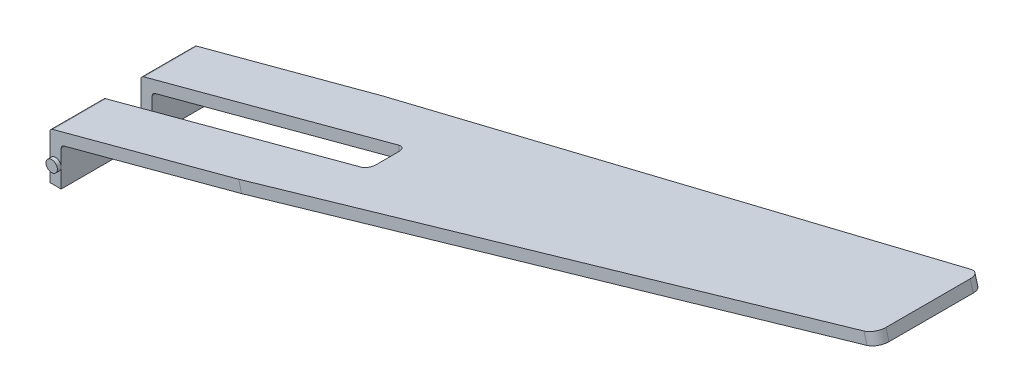
ISO-10303-21;
HEADER;
FILE_DESCRIPTION(('STEP AP214'),'2;1');
FILE_NAME('part.step','',(''),(''),'','','');
FILE_SCHEMA(('AUTOMOTIVE_DESIGN { 1 0 10303 214 1 1 1 1 }'));
ENDSEC;
DATA;
#1=APPLICATION_CONTEXT('core data for automotive mechanical design processes');
#2=APPLICATION_PROTOCOL_DEFINITION('international standard','automotive_design',2000,#1);
#3=PRODUCT_CONTEXT('',#1,'mechanical');
#4=PRODUCT('Part','Part','',(#3));
#5=PRODUCT_RELATED_PRODUCT_CATEGORY('part','',(#4));
#6=PRODUCT_DEFINITION_FORMATION('','',#4);
#7=PRODUCT_DEFINITION_CONTEXT('part definition',#1,'design');
#8=PRODUCT_DEFINITION('design','',#6,#7);
#9=PRODUCT_DEFINITION_SHAPE('','',#8);
#10=(LENGTH_UNIT() NAMED_UNIT(*) SI_UNIT(.MILLI.,.METRE.));
#11=(NAMED_UNIT(*) PLANE_ANGLE_UNIT() SI_UNIT($,.RADIAN.));
#12=(NAMED_UNIT(*) SI_UNIT($,.STERADIAN.) SOLID_ANGLE_UNIT());
#13=UNCERTAINTY_MEASURE_WITH_UNIT(LENGTH_MEASURE(1.E-05),#10,'distance_accuracy_value','');
#14=(GEOMETRIC_REPRESENTATION_CONTEXT(3) GLOBAL_UNCERTAINTY_ASSIGNED_CONTEXT((#13)) GLOBAL_UNIT_ASSIGNED_CONTEXT((#10,
#11,#12)) REPRESENTATION_CONTEXT('',''));
#15=CARTESIAN_POINT('',(0.,0.,0.));
#16=DIRECTION('',(0.,0.,1.));
#17=DIRECTION('',(1.,0.,0.));
#18=AXIS2_PLACEMENT_3D('',#15,#16,#17);
#19=CARTESIAN_POINT('',(0.3,0.,3.8));
#20=DIRECTION('',(0.,1.,0.));
#21=DIRECTION('',(0.,0.,1.));
#22=AXIS2_PLACEMENT_3D('',#19,#20,#21);
#23=PLANE('',#22);
#24=DIRECTION('',(0.,0.,-1.));
#25=VECTOR('',#24,1.);
#26=CARTESIAN_POINT('',(0.,0.,3.8));
#27=LINE('',#26,#25);
#28=CARTESIAN_POINT('',(0.,0.,3.8));
#29=VERTEX_POINT('',#28);
#30=CARTESIAN_POINT('',(0.,0.,2.40000000000001));
#31=VERTEX_POINT('',#30);
#32=EDGE_CURVE('E220',#29,#31,#27,.T.);
#33=ORIENTED_EDGE('',*,*,#32,.T.);
#34=DIRECTION('',(-1.,0.,0.));
#35=VECTOR('',#34,1.);
#36=CARTESIAN_POINT('',(0.,0.,2.40000000000001));
#37=LINE('',#36,#35);
#38=CARTESIAN_POINT('',(0.3,0.,2.40000000000001));
#39=VERTEX_POINT('',#38);
#40=EDGE_CURVE('E214',#39,#31,#37,.T.);
#41=ORIENTED_EDGE('',*,*,#40,.F.);
#42=DIRECTION('',(0.,0.,-1.));
#43=VECTOR('',#42,1.);
#44=CARTESIAN_POINT('',(0.3,0.,3.8));
#45=LINE('',#44,#43);
#46=CARTESIAN_POINT('',(0.3,0.,3.8));
#47=VERTEX_POINT('',#46);
#48=EDGE_CURVE('E236',#47,#39,#45,.T.);
#49=ORIENTED_EDGE('',*,*,#48,.F.);
#50=DIRECTION('',(1.,0.,0.));
#51=VECTOR('',#50,1.);
#52=CARTESIAN_POINT('',(0.3,0.,3.8));
#53=LINE('',#52,#51);
#54=EDGE_CURVE('E369',#29,#47,#53,.T.);
#55=ORIENTED_EDGE('',*,*,#54,.F.);
#56=EDGE_LOOP('',(#33,#41,#49,#55));
#57=FACE_BOUND('',#56,.T.);
#58=ADVANCED_FACE('F34',(#57),#23,.F.);
#59=CARTESIAN_POINT('',(0.3,1.,3.8));
#60=DIRECTION('',(-1.,0.,0.));
#61=DIRECTION('',(0.,-1.,0.));
#62=AXIS2_PLACEMENT_3D('',#59,#60,#61);
#63=PLANE('',#62);
#64=DIRECTION('',(0.,1.,0.));
#65=VECTOR('',#64,1.);
#66=CARTESIAN_POINT('',(0.3,1.,2.40000000000001));
#67=LINE('',#66,#65);
#68=CARTESIAN_POINT('',(0.3,0.923267301202103,2.40000000000001));
#69=VERTEX_POINT('',#68);
#70=EDGE_CURVE('E354',#39,#69,#67,.T.);
#71=ORIENTED_EDGE('',*,*,#70,.T.);
#72=DIRECTION('',(0.,0.,-1.));
#73=VECTOR('',#72,1.);
#74=CARTESIAN_POINT('',(0.3,0.923267301202103,3.8));
#75=LINE('',#74,#73);
#76=CARTESIAN_POINT('',(0.3,0.923267301202103,3.8));
#77=VERTEX_POINT('',#76);
#78=EDGE_CURVE('E287',#69,#77,#75,.F.);
#79=ORIENTED_EDGE('',*,*,#78,.T.);
#80=DIRECTION('',(0.,1.,0.));
#81=VECTOR('',#80,1.);
#82=CARTESIAN_POINT('',(0.3,1.,3.8));
#83=LINE('',#82,#81);
#84=CARTESIAN_POINT('',(0.3,0.5,3.8));
#85=VERTEX_POINT('',#84);
#86=EDGE_CURVE('E372',#85,#77,#83,.T.);
#87=ORIENTED_EDGE('',*,*,#86,.F.);
#88=EDGE_CURVE('E373',#47,#85,#83,.T.);
#89=ORIENTED_EDGE('',*,*,#88,.F.);
#90=ORIENTED_EDGE('',*,*,#48,.T.);
#91=EDGE_LOOP('',(#71,#79,#87,#89,#90));
#92=FACE_BOUND('',#91,.T.);
#93=ADVANCED_FACE('F423',(#92),#63,.F.);
#94=CARTESIAN_POINT('',(0.,0.,3.8));
#95=DIRECTION('',(1.,0.,0.));
#96=DIRECTION('',(0.,0.,-1.));
#97=AXIS2_PLACEMENT_3D('',#94,#95,#96);
#98=PLANE('',#97);
#99=DIRECTION('',(0.,-1.,0.));
#100=VECTOR('',#99,1.);
#101=CARTESIAN_POINT('',(0.,0.,3.8));
#102=LINE('',#101,#100);
#103=CARTESIAN_POINT('',(0.,1.15346539759579,3.8));
#104=VERTEX_POINT('',#103);
#105=CARTESIAN_POINT('',(0.,0.5,3.8));
#106=VERTEX_POINT('',#105);
#107=EDGE_CURVE('E221',#104,#106,#102,.T.);
#108=ORIENTED_EDGE('',*,*,#107,.F.);
#109=DIRECTION('',(0.,0.,-1.));
#110=VECTOR('',#109,1.);
#111=CARTESIAN_POINT('',(0.,1.15346539759579,3.8));
#112=LINE('',#111,#110);
#113=CARTESIAN_POINT('',(0.,1.15346539759579,2.40000000000001));
#114=VERTEX_POINT('',#113);
#115=EDGE_CURVE('E271',#104,#114,#112,.T.);
#116=ORIENTED_EDGE('',*,*,#115,.T.);
#117=DIRECTION('',(0.,-1.,0.));
#118=VECTOR('',#117,1.);
#119=CARTESIAN_POINT('',(0.,0.,2.40000000000001));
#120=LINE('',#119,#118);
#121=EDGE_CURVE('E205',#114,#31,#120,.T.);
#122=ORIENTED_EDGE('',*,*,#121,.T.);
#123=ORIENTED_EDGE('',*,*,#32,.F.);
#124=EDGE_CURVE('E225',#106,#29,#102,.T.);
#125=ORIENTED_EDGE('',*,*,#124,.F.);
#126=EDGE_LOOP('',(#108,#116,#122,#123,#125));
#127=FACE_BOUND('',#126,.T.);
#128=ADVANCED_FACE('F429',(#127),#98,.F.);
#129=CARTESIAN_POINT('',(0.,0.,3.8));
#130=DIRECTION('',(0.,0.,-1.));
#131=DIRECTION('',(-1.,0.,0.));
#132=AXIS2_PLACEMENT_3D('',#129,#130,#131);
#133=PLANE('',#132);
#134=DIRECTION('',(-0.965925826289069,-0.258819045102519,0.));
#135=VECTOR('',#134,1.);
#136=CARTESIAN_POINT('',(0.,1.23019809639369,3.8));
#137=LINE('',#136,#135);
#138=CARTESIAN_POINT('',(4.97765294954037,2.56395618442542,3.8));
#139=VERTEX_POINT('',#138);
#140=CARTESIAN_POINT('',(0.0741180954897481,1.2500579802247,3.8));
#141=VERTEX_POINT('',#140);
#142=EDGE_CURVE('E379',#139,#141,#137,.T.);
#143=ORIENTED_EDGE('',*,*,#142,.T.);
#144=CARTESIAN_POINT('',(0.1,1.15346539759579,3.8));
#145=DIRECTION('',(0.,0.,-1.));
#146=DIRECTION('',(-1.,0.,0.));
#147=AXIS2_PLACEMENT_3D('',#144,#145,#146);
#148=CIRCLE('',#147,0.1);
#149=EDGE_CURVE('E277',#141,#104,#148,.F.);
#150=ORIENTED_EDGE('',*,*,#149,.T.);
#151=ORIENTED_EDGE('',*,*,#107,.T.);
#152=CARTESIAN_POINT('',(0.15,0.5,3.8));
#153=DIRECTION('',(0.,0.,-1.));
#154=DIRECTION('',(-1.,0.,0.));
#155=AXIS2_PLACEMENT_3D('',#152,#153,#154);
#156=CIRCLE('',#155,0.15);
#157=EDGE_CURVE('E368',#106,#85,#156,.T.);
#158=ORIENTED_EDGE('',*,*,#157,.T.);
#159=ORIENTED_EDGE('',*,*,#86,.T.);
#160=CARTESIAN_POINT('',(0.400000000000001,0.923267301202103,3.8));
#161=DIRECTION('',(0.,0.,-1.));
#162=DIRECTION('',(-1.,0.,0.));
#163=AXIS2_PLACEMENT_3D('',#160,#161,#162);
#164=CIRCLE('',#163,0.1);
#165=CARTESIAN_POINT('',(0.374118095489748,1.01985988383101,3.8));
#166=VERTEX_POINT('',#165);
#167=EDGE_CURVE('E296',#77,#166,#164,.T.);
#168=ORIENTED_EDGE('',*,*,#167,.T.);
#169=DIRECTION('',(0.965925826289069,0.258819045102518,0.));
#170=VECTOR('',#169,1.);
#171=CARTESIAN_POINT('',(21.3280138918903,6.63443934076237,3.8));
#172=LINE('',#171,#170);
#173=CARTESIAN_POINT('',(5.05529866307113,2.27417843653869,3.8));
#174=VERTEX_POINT('',#173);
#175=EDGE_CURVE('E376',#166,#174,#172,.T.);
#176=ORIENTED_EDGE('',*,*,#175,.T.);
#177=DIRECTION('',(-0.258819045102525,0.965925826289067,0.));
#178=VECTOR('',#177,1.);
#179=CARTESIAN_POINT('',(5.28520247363879,1.41616573464651,3.8));
#180=LINE('',#179,#178);
#181=EDGE_CURVE('E239',#174,#139,#180,.T.);
#182=ORIENTED_EDGE('',*,*,#181,.T.);
#183=EDGE_LOOP('',(#143,#150,#151,#158,#159,#168,#176,#182));
#184=FACE_BOUND('',#183,.T.);
#185=ADVANCED_FACE('F440',(#184),#133,.F.);
#186=CARTESIAN_POINT('',(0.,0.,0.));
#187=DIRECTION('',(0.,0.,-1.));
#188=DIRECTION('',(-1.,0.,0.));
#189=AXIS2_PLACEMENT_3D('',#186,#187,#188);
#190=PLANE('',#189);
#191=DIRECTION('',(0.,-1.,0.));
#192=VECTOR('',#191,1.);
#193=CARTESIAN_POINT('',(0.,0.,0.));
#194=LINE('',#193,#192);
#195=CARTESIAN_POINT('',(0.,1.15346539759579,0.));
#196=VERTEX_POINT('',#195);
#197=CARTESIAN_POINT('',(0.,0.5,0.));
#198=VERTEX_POINT('',#197);
#199=EDGE_CURVE('E229',#196,#198,#194,.T.);
#200=ORIENTED_EDGE('',*,*,#199,.F.);
#201=CARTESIAN_POINT('',(0.1,1.15346539759579,0.));
#202=DIRECTION('',(0.,0.,-1.));
#203=DIRECTION('',(-1.,0.,0.));
#204=AXIS2_PLACEMENT_3D('',#201,#202,#203);
#205=CIRCLE('',#204,0.1);
#206=CARTESIAN_POINT('',(0.0741180954897481,1.2500579802247,0.));
#207=VERTEX_POINT('',#206);
#208=EDGE_CURVE('E264',#196,#207,#205,.T.);
#209=ORIENTED_EDGE('',*,*,#208,.T.);
#210=DIRECTION('',(-0.965925826289069,-0.258819045102519,0.));
#211=VECTOR('',#210,1.);
#212=CARTESIAN_POINT('',(0.,1.23019809639369,0.));
#213=LINE('',#212,#211);
#214=CARTESIAN_POINT('',(4.97765294954035,2.56395618442541,0.));
#215=VERTEX_POINT('',#214);
#216=EDGE_CURVE('E389',#215,#207,#213,.T.);
#217=ORIENTED_EDGE('',*,*,#216,.F.);
#218=DIRECTION('',(0.258819045102525,-0.965925826289067,0.));
#219=VECTOR('',#218,1.);
#220=CARTESIAN_POINT('',(5.05529866307114,2.27417843653857,0.));
#221=LINE('',#220,#219);
#222=CARTESIAN_POINT('',(5.05529866307111,2.27417843653869,0.));
#223=VERTEX_POINT('',#222);
#224=EDGE_CURVE('E252',#215,#223,#221,.T.);
#225=ORIENTED_EDGE('',*,*,#224,.T.);
#226=DIRECTION('',(0.965925826289069,0.258819045102518,0.));
#227=VECTOR('',#226,1.);
#228=CARTESIAN_POINT('',(21.3280138918903,6.63443934076237,0.));
#229=LINE('',#228,#227);
#230=CARTESIAN_POINT('',(0.374118095489748,1.01985988383101,0.));
#231=VERTEX_POINT('',#230);
#232=EDGE_CURVE('E388',#231,#223,#229,.T.);
#233=ORIENTED_EDGE('',*,*,#232,.F.);
#234=CARTESIAN_POINT('',(0.400000000000001,0.923267301202103,0.));
#235=DIRECTION('',(0.,0.,-1.));
#236=DIRECTION('',(-1.,0.,0.));
#237=AXIS2_PLACEMENT_3D('',#234,#235,#236);
#238=CIRCLE('',#237,0.1);
#239=CARTESIAN_POINT('',(0.3,0.923267301202103,0.));
#240=VERTEX_POINT('',#239);
#241=EDGE_CURVE('E289',#231,#240,#238,.F.);
#242=ORIENTED_EDGE('',*,*,#241,.T.);
#243=DIRECTION('',(0.,1.,0.));
#244=VECTOR('',#243,1.);
#245=CARTESIAN_POINT('',(0.3,1.,0.));
#246=LINE('',#245,#244);
#247=CARTESIAN_POINT('',(0.3,0.5,0.));
#248=VERTEX_POINT('',#247);
#249=EDGE_CURVE('E384',#248,#240,#246,.T.);
#250=ORIENTED_EDGE('',*,*,#249,.F.);
#251=CARTESIAN_POINT('',(0.15,0.5,0.));
#252=DIRECTION('',(0.,0.,-1.));
#253=DIRECTION('',(-1.,0.,0.));
#254=AXIS2_PLACEMENT_3D('',#251,#252,#253);
#255=CIRCLE('',#254,0.15);
#256=EDGE_CURVE('E206',#198,#248,#255,.T.);
#257=ORIENTED_EDGE('',*,*,#256,.F.);
#258=EDGE_LOOP('',(#200,#209,#217,#225,#233,#242,#250,#257));
#259=FACE_BOUND('',#258,.T.);
#260=ADVANCED_FACE('F401',(#259),#190,.T.);
#261=CARTESIAN_POINT('',(0.3,0.,1.4));
#262=VERTEX_POINT('',#261);
#263=CARTESIAN_POINT('',(0.3,0.,0.));
#264=VERTEX_POINT('',#263);
#265=EDGE_CURVE('E213',#262,#264,#45,.T.);
#266=ORIENTED_EDGE('',*,*,#265,.F.);
#267=DIRECTION('',(1.,0.,0.));
#268=VECTOR('',#267,1.);
#269=CARTESIAN_POINT('',(0.,0.,1.4));
#270=LINE('',#269,#268);
#271=CARTESIAN_POINT('',(0.,0.,1.4));
#272=VERTEX_POINT('',#271);
#273=EDGE_CURVE('E197',#272,#262,#270,.T.);
#274=ORIENTED_EDGE('',*,*,#273,.F.);
#275=CARTESIAN_POINT('',(0.,0.,0.));
#276=VERTEX_POINT('',#275);
#277=EDGE_CURVE('E211',#272,#276,#27,.T.);
#278=ORIENTED_EDGE('',*,*,#277,.T.);
#279=DIRECTION('',(1.,0.,0.));
#280=VECTOR('',#279,1.);
#281=CARTESIAN_POINT('',(0.3,0.,0.));
#282=LINE('',#281,#280);
#283=EDGE_CURVE('E382',#276,#264,#282,.T.);
#284=ORIENTED_EDGE('',*,*,#283,.T.);
#285=EDGE_LOOP('',(#266,#274,#278,#284));
#286=FACE_BOUND('',#285,.T.);
#287=ADVANCED_FACE('F209',(#286),#23,.F.);
#288=ORIENTED_EDGE('',*,*,#249,.T.);
#289=DIRECTION('',(0.,0.,-1.));
#290=VECTOR('',#289,1.);
#291=CARTESIAN_POINT('',(0.3,0.923267301202103,1.4));
#292=LINE('',#291,#290);
#293=CARTESIAN_POINT('',(0.3,0.923267301202103,1.4));
#294=VERTEX_POINT('',#293);
#295=EDGE_CURVE('E285',#240,#294,#292,.F.);
#296=ORIENTED_EDGE('',*,*,#295,.T.);
#297=DIRECTION('',(0.,-1.,0.));
#298=VECTOR('',#297,1.);
#299=CARTESIAN_POINT('',(0.3,1.,1.4));
#300=LINE('',#299,#298);
#301=EDGE_CURVE('E344',#294,#262,#300,.T.);
#302=ORIENTED_EDGE('',*,*,#301,.T.);
#303=ORIENTED_EDGE('',*,*,#265,.T.);
#304=EDGE_CURVE('E385',#264,#248,#246,.T.);
#305=ORIENTED_EDGE('',*,*,#304,.T.);
#306=EDGE_LOOP('',(#288,#296,#302,#303,#305));
#307=FACE_BOUND('',#306,.T.);
#308=ADVANCED_FACE('F432',(#307),#63,.F.);
#309=CARTESIAN_POINT('',(21.3280138918903,6.63443934076237,3.8));
#310=DIRECTION('',(-0.258819045102518,0.965925826289069,0.));
#311=DIRECTION('',(-0.965925826289069,-0.258819045102518,0.));
#312=AXIS2_PLACEMENT_3D('',#309,#310,#311);
#313=PLANE('',#312);
#314=DIRECTION('',(0.965500683811202,0.258705128518906,0.0296662440851079));
#315=VECTOR('',#314,1.);
#316=CARTESIAN_POINT('',(21.3280138918903,6.63443934076237,0.5));
#317=LINE('',#316,#315);
#318=CARTESIAN_POINT('',(21.0468327614028,6.55909708392138,0.491360349931353));
#319=VERTEX_POINT('',#318);
#320=EDGE_CURVE('E247',#223,#319,#317,.T.);
#321=ORIENTED_EDGE('',*,*,#320,.T.);
#322=CARTESIAN_POINT('',(21.0382361440036,6.55679362723161,0.791228307967169));
#323=DIRECTION('',(-0.258819045102518,0.965925826289069,0.));
#324=DIRECTION('',(-0.965925826289069,-0.258819045102518,0.));
#325=AXIS2_PLACEMENT_3D('',#322,#323,#324);
#326=CIRCLE('',#325,0.3);
#327=CARTESIAN_POINT('',(21.3280138918903,6.63443934076237,0.79122830796717));
#328=VERTEX_POINT('',#327);
#329=EDGE_CURVE('E312',#319,#328,#326,.F.);
#330=ORIENTED_EDGE('',*,*,#329,.T.);
#331=DIRECTION('',(0.,0.,-1.));
#332=VECTOR('',#331,1.);
#333=CARTESIAN_POINT('',(21.3280138918903,6.63443934076237,3.8));
#334=LINE('',#333,#332);
#335=CARTESIAN_POINT('',(21.3280138918903,6.63443934076237,3.00877169203283));
#336=VERTEX_POINT('',#335);
#337=EDGE_CURVE('E233',#336,#328,#334,.T.);
#338=ORIENTED_EDGE('',*,*,#337,.F.);
#339=CARTESIAN_POINT('',(21.0382361440036,6.55679362723161,3.00877169203283));
#340=DIRECTION('',(-0.258819045102518,0.965925826289069,0.));
#341=DIRECTION('',(-0.965925826289069,-0.258819045102518,0.));
#342=AXIS2_PLACEMENT_3D('',#339,#340,#341);
#343=CIRCLE('',#342,0.3);
#344=CARTESIAN_POINT('',(21.0468327614028,6.55909708392138,3.30863965006865));
#345=VERTEX_POINT('',#344);
#346=EDGE_CURVE('E310',#336,#345,#343,.F.);
#347=ORIENTED_EDGE('',*,*,#346,.T.);
#348=DIRECTION('',(0.965500683811202,0.258705128518906,-0.0296662440851079));
#349=VECTOR('',#348,1.);
#350=CARTESIAN_POINT('',(5.05529866307114,2.27417843653869,3.8));
#351=LINE('',#350,#349);
#352=EDGE_CURVE('E250',#345,#174,#351,.F.);
#353=ORIENTED_EDGE('',*,*,#352,.T.);
#354=ORIENTED_EDGE('',*,*,#175,.F.);
#355=DIRECTION('',(0.,0.,-1.));
#356=VECTOR('',#355,1.);
#357=CARTESIAN_POINT('',(0.374118095489749,1.01985988383101,2.40000000000001));
#358=LINE('',#357,#356);
#359=CARTESIAN_POINT('',(0.374118095489741,1.01985988383101,2.40000000000001));
#360=VERTEX_POINT('',#359);
#361=EDGE_CURVE('E279',#166,#360,#358,.T.);
#362=ORIENTED_EDGE('',*,*,#361,.T.);
#363=DIRECTION('',(0.965925826289069,0.258819045102518,0.));
#364=VECTOR('',#363,1.);
#365=CARTESIAN_POINT('',(21.3280138918903,6.63443934076237,2.40000000000002));
#366=LINE('',#365,#364);
#367=CARTESIAN_POINT('',(6.8,2.74166975080228,2.40000000000001));
#368=VERTEX_POINT('',#367);
#369=EDGE_CURVE('E343',#360,#368,#366,.T.);
#370=ORIENTED_EDGE('',*,*,#369,.T.);
#371=CARTESIAN_POINT('',(6.8,2.74166975080228,2.20000000000001));
#372=DIRECTION('',(-0.258819045102518,0.965925826289069,0.));
#373=DIRECTION('',(0.965925826289069,0.258819045102518,0.));
#374=AXIS2_PLACEMENT_3D('',#371,#372,#373);
#375=ELLIPSE('',#374,0.207055236082016,0.2);
#376=CARTESIAN_POINT('',(7.,2.7952595892885,2.20000000000001));
#377=VERTEX_POINT('',#376);
#378=EDGE_CURVE('E325',#368,#377,#375,.T.);
#379=ORIENTED_EDGE('',*,*,#378,.T.);
#380=DIRECTION('',(0.,0.,-1.));
#381=VECTOR('',#380,1.);
#382=CARTESIAN_POINT('',(7.,2.7952595892885,3.79999999999999));
#383=LINE('',#382,#381);
#384=CARTESIAN_POINT('',(7.,2.7952595892885,1.60000000000001));
#385=VERTEX_POINT('',#384);
#386=EDGE_CURVE('E349',#377,#385,#383,.T.);
#387=ORIENTED_EDGE('',*,*,#386,.T.);
#388=CARTESIAN_POINT('',(6.8,2.74166975080228,1.60000000000001));
#389=DIRECTION('',(-0.258819045102518,0.965925826289069,0.));
#390=DIRECTION('',(0.965925826289069,0.258819045102518,0.));
#391=AXIS2_PLACEMENT_3D('',#388,#389,#390);
#392=ELLIPSE('',#391,0.207055236082016,0.2);
#393=CARTESIAN_POINT('',(6.8,2.74166975080228,1.40000000000001));
#394=VERTEX_POINT('',#393);
#395=EDGE_CURVE('E42',#385,#394,#392,.T.);
#396=ORIENTED_EDGE('',*,*,#395,.T.);
#397=DIRECTION('',(-0.965925826289069,-0.258819045102518,0.));
#398=VECTOR('',#397,1.);
#399=CARTESIAN_POINT('',(21.3280138918903,6.63443934076237,1.40000000000003));
#400=LINE('',#399,#398);
#401=CARTESIAN_POINT('',(0.374118095489741,1.01985988383101,1.4));
#402=VERTEX_POINT('',#401);
#403=EDGE_CURVE('E474',#394,#402,#400,.T.);
#404=ORIENTED_EDGE('',*,*,#403,.T.);
#405=DIRECTION('',(0.,0.,-1.));
#406=VECTOR('',#405,1.);
#407=CARTESIAN_POINT('',(0.374118095489749,1.01985988383101,0.));
#408=LINE('',#407,#406);
#409=EDGE_CURVE('E282',#402,#231,#408,.T.);
#410=ORIENTED_EDGE('',*,*,#409,.T.);
#411=ORIENTED_EDGE('',*,*,#232,.T.);
#412=EDGE_LOOP('',(#321,#330,#338,#347,#353,#354,#362,#370,#379,#387,#396,#404,#410,#411));
#413=FACE_BOUND('',#412,.T.);
#414=ADVANCED_FACE('F348',(#413),#313,.F.);
#415=CARTESIAN_POINT('',(21.2503681783595,6.9242170886491,3.8));
#416=DIRECTION('',(-0.965925826289067,-0.258819045102525,0.));
#417=DIRECTION('',(0.258819045102525,-0.965925826289067,0.));
#418=AXIS2_PLACEMENT_3D('',#415,#416,#417);
#419=PLANE('',#418);
#420=ORIENTED_EDGE('',*,*,#337,.T.);
#421=DIRECTION('',(-0.258819045102525,0.965925826289067,0.));
#422=VECTOR('',#421,1.);
#423=CARTESIAN_POINT('',(21.2503681783595,6.9242170886491,0.791228307967169));
#424=LINE('',#423,#422);
#425=CARTESIAN_POINT('',(21.2503681783595,6.9242170886491,0.79122830796717));
#426=VERTEX_POINT('',#425);
#427=EDGE_CURVE('E301',#328,#426,#424,.T.);
#428=ORIENTED_EDGE('',*,*,#427,.T.);
#429=DIRECTION('',(0.,0.,-1.));
#430=VECTOR('',#429,1.);
#431=CARTESIAN_POINT('',(21.2503681783595,6.9242170886491,3.8));
#432=LINE('',#431,#430);
#433=CARTESIAN_POINT('',(21.2503681783595,6.9242170886491,3.00877169203283));
#434=VERTEX_POINT('',#433);
#435=EDGE_CURVE('E224',#434,#426,#432,.T.);
#436=ORIENTED_EDGE('',*,*,#435,.F.);
#437=DIRECTION('',(-0.258819045102525,0.965925826289067,0.));
#438=VECTOR('',#437,1.);
#439=CARTESIAN_POINT('',(21.3280138918903,6.63443934076237,3.00877169203283));
#440=LINE('',#439,#438);
#441=EDGE_CURVE('E298',#434,#336,#440,.F.);
#442=ORIENTED_EDGE('',*,*,#441,.T.);
#443=EDGE_LOOP('',(#420,#428,#436,#442));
#444=FACE_BOUND('',#443,.T.);
#445=ADVANCED_FACE('F498',(#444),#419,.F.);
#446=CARTESIAN_POINT('',(0.,1.23019809639369,3.8));
#447=DIRECTION('',(0.258819045102519,-0.965925826289069,0.));
#448=DIRECTION('',(0.965925826289069,0.258819045102519,0.));
#449=AXIS2_PLACEMENT_3D('',#446,#447,#448);
#450=PLANE('',#449);
#451=ORIENTED_EDGE('',*,*,#435,.T.);
#452=CARTESIAN_POINT('',(20.9605904304728,6.84657137511834,0.791228307967169));
#453=DIRECTION('',(0.258819045102519,-0.965925826289069,0.));
#454=DIRECTION('',(0.965925826289069,0.258819045102519,0.));
#455=AXIS2_PLACEMENT_3D('',#452,#453,#454);
#456=CIRCLE('',#455,0.3);
#457=CARTESIAN_POINT('',(20.969187047872,6.84887483180811,0.491360349931353));
#458=VERTEX_POINT('',#457);
#459=EDGE_CURVE('E306',#426,#458,#456,.F.);
#460=ORIENTED_EDGE('',*,*,#459,.T.);
#461=DIRECTION('',(-0.965500683811202,-0.258705128518906,-0.0296662440851079));
#462=VECTOR('',#461,1.);
#463=CARTESIAN_POINT('',(21.2503681783595,6.9242170886491,0.5));
#464=LINE('',#463,#462);
#465=EDGE_CURVE('E242',#458,#215,#464,.T.);
#466=ORIENTED_EDGE('',*,*,#465,.T.);
#467=ORIENTED_EDGE('',*,*,#216,.T.);
#468=DIRECTION('',(0.,0.,-1.));
#469=VECTOR('',#468,1.);
#470=CARTESIAN_POINT('',(0.0741180954897481,1.2500579802247,3.8));
#471=LINE('',#470,#469);
#472=CARTESIAN_POINT('',(0.0741180954897481,1.2500579802247,1.4));
#473=VERTEX_POINT('',#472);
#474=EDGE_CURVE('E268',#207,#473,#471,.F.);
#475=ORIENTED_EDGE('',*,*,#474,.T.);
#476=DIRECTION('',(0.965925826289069,0.258819045102519,0.));
#477=VECTOR('',#476,1.);
#478=CARTESIAN_POINT('',(0.,1.23019809639369,1.4));
#479=LINE('',#478,#477);
#480=CARTESIAN_POINT('',(6.8,3.05225260492531,1.40000000000001));
#481=VERTEX_POINT('',#480);
#482=EDGE_CURVE('E476',#473,#481,#479,.T.);
#483=ORIENTED_EDGE('',*,*,#482,.T.);
#484=CARTESIAN_POINT('',(6.8,3.05225260492531,1.60000000000001));
#485=DIRECTION('',(0.258819045102519,-0.965925826289069,0.));
#486=DIRECTION('',(0.965925826289069,0.258819045102519,0.));
#487=AXIS2_PLACEMENT_3D('',#484,#485,#486);
#488=ELLIPSE('',#487,0.207055236082016,0.2);
#489=CARTESIAN_POINT('',(7.,3.10584244341153,1.60000000000001));
#490=VERTEX_POINT('',#489);
#491=EDGE_CURVE('E11',#481,#490,#488,.T.);
#492=ORIENTED_EDGE('',*,*,#491,.T.);
#493=DIRECTION('',(0.,0.,1.));
#494=VECTOR('',#493,1.);
#495=CARTESIAN_POINT('',(7.,3.10584244341153,3.80000000000001));
#496=LINE('',#495,#494);
#497=CARTESIAN_POINT('',(7.,3.10584244341153,2.20000000000001));
#498=VERTEX_POINT('',#497);
#499=EDGE_CURVE('E259',#490,#498,#496,.T.);
#500=ORIENTED_EDGE('',*,*,#499,.T.);
#501=CARTESIAN_POINT('',(6.8,3.05225260492531,2.20000000000001));
#502=DIRECTION('',(0.258819045102519,-0.965925826289069,0.));
#503=DIRECTION('',(0.965925826289069,0.258819045102519,0.));
#504=AXIS2_PLACEMENT_3D('',#501,#502,#503);
#505=ELLIPSE('',#504,0.207055236082016,0.2);
#506=CARTESIAN_POINT('',(6.8,3.05225260492531,2.40000000000001));
#507=VERTEX_POINT('',#506);
#508=EDGE_CURVE('E327',#498,#507,#505,.T.);
#509=ORIENTED_EDGE('',*,*,#508,.T.);
#510=DIRECTION('',(-0.965925826289069,-0.258819045102519,0.));
#511=VECTOR('',#510,1.);
#512=CARTESIAN_POINT('',(0.,1.23019809639369,2.40000000000001));
#513=LINE('',#512,#511);
#514=CARTESIAN_POINT('',(0.0741180954897481,1.2500579802247,2.40000000000001));
#515=VERTEX_POINT('',#514);
#516=EDGE_CURVE('E332',#507,#515,#513,.T.);
#517=ORIENTED_EDGE('',*,*,#516,.T.);
#518=DIRECTION('',(0.,0.,-1.));
#519=VECTOR('',#518,1.);
#520=CARTESIAN_POINT('',(0.0741180954897481,1.2500579802247,3.8));
#521=LINE('',#520,#519);
#522=EDGE_CURVE('E266',#515,#141,#521,.F.);
#523=ORIENTED_EDGE('',*,*,#522,.T.);
#524=ORIENTED_EDGE('',*,*,#142,.F.);
#525=DIRECTION('',(-0.965500683811202,-0.258705128518906,0.0296662440851079));
#526=VECTOR('',#525,1.);
#527=CARTESIAN_POINT('',(4.97765294954038,2.56395618442542,3.8));
#528=LINE('',#527,#526);
#529=CARTESIAN_POINT('',(20.969187047872,6.84887483180811,3.30863965006865));
#530=VERTEX_POINT('',#529);
#531=EDGE_CURVE('E244',#139,#530,#528,.F.);
#532=ORIENTED_EDGE('',*,*,#531,.T.);
#533=CARTESIAN_POINT('',(20.9605904304728,6.84657137511834,3.00877169203283));
#534=DIRECTION('',(0.258819045102519,-0.965925826289069,0.));
#535=DIRECTION('',(0.965925826289069,0.258819045102519,0.));
#536=AXIS2_PLACEMENT_3D('',#533,#534,#535);
#537=CIRCLE('',#536,0.3);
#538=EDGE_CURVE('E304',#530,#434,#537,.F.);
#539=ORIENTED_EDGE('',*,*,#538,.T.);
#540=EDGE_LOOP('',(#451,#460,#466,#467,#475,#483,#492,#500,#509,#517,#523,#524,#532,#539));
#541=FACE_BOUND('',#540,.T.);
#542=ADVANCED_FACE('F331',(#541),#450,.F.);
#543=DIRECTION('',(0.,1.,0.));
#544=VECTOR('',#543,1.);
#545=CARTESIAN_POINT('',(0.,0.,1.4));
#546=LINE('',#545,#544);
#547=CARTESIAN_POINT('',(0.,1.15346539759579,1.4));
#548=VERTEX_POINT('',#547);
#549=EDGE_CURVE('E193',#272,#548,#546,.T.);
#550=ORIENTED_EDGE('',*,*,#549,.T.);
#551=DIRECTION('',(0.,0.,-1.));
#552=VECTOR('',#551,1.);
#553=CARTESIAN_POINT('',(0.,1.15346539759579,3.8));
#554=LINE('',#553,#552);
#555=EDGE_CURVE('E262',#548,#196,#554,.T.);
#556=ORIENTED_EDGE('',*,*,#555,.T.);
#557=ORIENTED_EDGE('',*,*,#199,.T.);
#558=EDGE_CURVE('E218',#198,#276,#194,.T.);
#559=ORIENTED_EDGE('',*,*,#558,.T.);
#560=ORIENTED_EDGE('',*,*,#277,.F.);
#561=EDGE_LOOP('',(#550,#556,#557,#559,#560));
#562=FACE_BOUND('',#561,.T.);
#563=ADVANCED_FACE('F216',(#562),#98,.F.);
#564=ORIENTED_EDGE('',*,*,#88,.T.);
#565=EDGE_CURVE('E365',#85,#106,#156,.T.);
#566=ORIENTED_EDGE('',*,*,#565,.T.);
#567=ORIENTED_EDGE('',*,*,#124,.T.);
#568=ORIENTED_EDGE('',*,*,#54,.T.);
#569=EDGE_LOOP('',(#564,#566,#567,#568));
#570=FACE_BOUND('',#569,.T.);
#571=ADVANCED_FACE('F447',(#570),#133,.F.);
#572=EDGE_CURVE('E255',#248,#198,#255,.T.);
#573=ORIENTED_EDGE('',*,*,#572,.F.);
#574=ORIENTED_EDGE('',*,*,#304,.F.);
#575=ORIENTED_EDGE('',*,*,#283,.F.);
#576=ORIENTED_EDGE('',*,*,#558,.F.);
#577=EDGE_LOOP('',(#573,#574,#575,#576));
#578=FACE_BOUND('',#577,.T.);
#579=ADVANCED_FACE('F397',(#578),#190,.T.);
#580=CARTESIAN_POINT('',(5.28520247363879,1.41616573464651,3.8));
#581=DIRECTION('',(-0.028655391330801,-0.00767818896588604,-0.999559860119384));
#582=DIRECTION('',(-0.258819045102525,0.965925826289067,0.));
#583=AXIS2_PLACEMENT_3D('',#580,#581,#582);
#584=PLANE('',#583);
#585=ORIENTED_EDGE('',*,*,#352,.F.);
#586=DIRECTION('',(0.258819045102525,-0.965925826289067,0.));
#587=VECTOR('',#586,1.);
#588=CARTESIAN_POINT('',(20.969187047872,6.8488748318081,3.30863965006865));
#589=LINE('',#588,#587);
#590=EDGE_CURVE('E314',#345,#530,#589,.F.);
#591=ORIENTED_EDGE('',*,*,#590,.T.);
#592=ORIENTED_EDGE('',*,*,#531,.F.);
#593=ORIENTED_EDGE('',*,*,#181,.F.);
#594=EDGE_LOOP('',(#585,#591,#592,#593));
#595=FACE_BOUND('',#594,.T.);
#596=ADVANCED_FACE('F418',(#595),#584,.F.);
#597=CARTESIAN_POINT('',(21.2503681783595,6.9242170886491,0.5));
#598=DIRECTION('',(0.028655391330801,0.00767818896588604,-0.999559860119384));
#599=DIRECTION('',(0.258819045102525,-0.965925826289067,0.));
#600=AXIS2_PLACEMENT_3D('',#597,#598,#599);
#601=PLANE('',#600);
#602=ORIENTED_EDGE('',*,*,#465,.F.);
#603=DIRECTION('',(-0.258819045102525,0.965925826289067,0.));
#604=VECTOR('',#603,1.);
#605=CARTESIAN_POINT('',(21.0468327614028,6.55909708392138,0.491360349931353));
#606=LINE('',#605,#604);
#607=EDGE_CURVE('E308',#458,#319,#606,.F.);
#608=ORIENTED_EDGE('',*,*,#607,.T.);
#609=ORIENTED_EDGE('',*,*,#320,.F.);
#610=ORIENTED_EDGE('',*,*,#224,.F.);
#611=EDGE_LOOP('',(#602,#608,#609,#610));
#612=FACE_BOUND('',#611,.T.);
#613=ADVANCED_FACE('F413',(#612),#601,.T.);
#614=CARTESIAN_POINT('',(0.15,0.5,-0.0999999999999998));
#615=DIRECTION('',(0.,0.,1.));
#616=DIRECTION('',(1.,0.,0.));
#617=AXIS2_PLACEMENT_3D('',#614,#615,#616);
#618=PLANE('',#617);
#619=CARTESIAN_POINT('',(0.15,0.5,-0.0999999999999998));
#620=DIRECTION('',(0.,0.,1.));
#621=DIRECTION('',(1.,0.,0.));
#622=AXIS2_PLACEMENT_3D('',#619,#620,#621);
#623=CIRCLE('',#622,0.15);
#624=CARTESIAN_POINT('',(0.3,0.5,-0.0999999999999998));
#625=VERTEX_POINT('',#624);
#626=EDGE_CURVE('E357',#625,#625,#623,.T.);
#627=ORIENTED_EDGE('',*,*,#626,.F.);
#628=EDGE_LOOP('',(#627));
#629=FACE_BOUND('',#628,.T.);
#630=ADVANCED_FACE('F408',(#629),#618,.F.);
#631=CARTESIAN_POINT('',(0.15,0.5,-0.0999999999999998));
#632=DIRECTION('',(0.,0.,1.));
#633=DIRECTION('',(1.,0.,0.));
#634=AXIS2_PLACEMENT_3D('',#631,#632,#633);
#635=CYLINDRICAL_SURFACE('',#634,0.15);
#636=ORIENTED_EDGE('',*,*,#572,.T.);
#637=ORIENTED_EDGE('',*,*,#256,.T.);
#638=EDGE_LOOP('',(#636,#637));
#639=FACE_BOUND('',#638,.T.);
#640=ORIENTED_EDGE('',*,*,#626,.T.);
#641=EDGE_LOOP('',(#640));
#642=FACE_BOUND('',#641,.T.);
#643=ADVANCED_FACE('F404',(#639,#642),#635,.T.);
#644=CARTESIAN_POINT('',(0.15,0.5,3.9));
#645=DIRECTION('',(0.,0.,1.));
#646=DIRECTION('',(1.,0.,0.));
#647=AXIS2_PLACEMENT_3D('',#644,#645,#646);
#648=CIRCLE('',#647,0.15);
#649=CARTESIAN_POINT('',(0.3,0.5,3.9));
#650=VERTEX_POINT('',#649);
#651=EDGE_CURVE('E353',#650,#650,#648,.T.);
#652=ORIENTED_EDGE('',*,*,#651,.F.);
#653=EDGE_LOOP('',(#652));
#654=FACE_BOUND('',#653,.T.);
#655=ORIENTED_EDGE('',*,*,#157,.F.);
#656=ORIENTED_EDGE('',*,*,#565,.F.);
#657=EDGE_LOOP('',(#655,#656));
#658=FACE_BOUND('',#657,.T.);
#659=ADVANCED_FACE('F407',(#654,#658),#635,.T.);
#660=CARTESIAN_POINT('',(0.15,0.5,3.9));
#661=DIRECTION('',(0.,0.,1.));
#662=DIRECTION('',(1.,0.,0.));
#663=AXIS2_PLACEMENT_3D('',#660,#661,#662);
#664=PLANE('',#663);
#665=ORIENTED_EDGE('',*,*,#651,.T.);
#666=EDGE_LOOP('',(#665));
#667=FACE_BOUND('',#666,.T.);
#668=ADVANCED_FACE('F541',(#667),#664,.T.);
#669=CARTESIAN_POINT('',(7.,10.,2.40000000000001));
#670=DIRECTION('',(1.,0.,0.));
#671=DIRECTION('',(0.,0.,-1.));
#672=AXIS2_PLACEMENT_3D('',#669,#670,#671);
#673=PLANE('',#672);
#674=ORIENTED_EDGE('',*,*,#386,.F.);
#675=DIRECTION('',(0.,-1.,0.));
#676=VECTOR('',#675,1.);
#677=CARTESIAN_POINT('',(7.,3.10584244341153,2.20000000000001));
#678=LINE('',#677,#676);
#679=EDGE_CURVE('E322',#377,#498,#678,.F.);
#680=ORIENTED_EDGE('',*,*,#679,.T.);
#681=ORIENTED_EDGE('',*,*,#499,.F.);
#682=DIRECTION('',(0.,-1.,0.));
#683=VECTOR('',#682,1.);
#684=CARTESIAN_POINT('',(7.,2.7952595892885,1.60000000000001));
#685=LINE('',#684,#683);
#686=EDGE_CURVE('E319',#490,#385,#685,.T.);
#687=ORIENTED_EDGE('',*,*,#686,.T.);
#688=EDGE_LOOP('',(#674,#680,#681,#687));
#689=FACE_BOUND('',#688,.T.);
#690=ADVANCED_FACE('F351',(#689),#673,.F.);
#691=CARTESIAN_POINT('',(0.,10.,2.40000000000001));
#692=DIRECTION('',(0.,0.,1.));
#693=DIRECTION('',(1.,0.,0.));
#694=AXIS2_PLACEMENT_3D('',#691,#692,#693);
#695=PLANE('',#694);
#696=ORIENTED_EDGE('',*,*,#516,.F.);
#697=DIRECTION('',(0.,-1.,0.));
#698=VECTOR('',#697,1.);
#699=CARTESIAN_POINT('',(6.8,2.7952595892885,2.40000000000001));
#700=LINE('',#699,#698);
#701=EDGE_CURVE('E316',#507,#368,#700,.T.);
#702=ORIENTED_EDGE('',*,*,#701,.T.);
#703=ORIENTED_EDGE('',*,*,#369,.F.);
#704=CARTESIAN_POINT('',(0.400000000000001,0.923267301202103,2.40000000000001));
#705=DIRECTION('',(0.,0.,1.));
#706=DIRECTION('',(1.,0.,0.));
#707=AXIS2_PLACEMENT_3D('',#704,#705,#706);
#708=CIRCLE('',#707,0.1);
#709=EDGE_CURVE('E294',#360,#69,#708,.T.);
#710=ORIENTED_EDGE('',*,*,#709,.T.);
#711=ORIENTED_EDGE('',*,*,#70,.F.);
#712=ORIENTED_EDGE('',*,*,#40,.T.);
#713=ORIENTED_EDGE('',*,*,#121,.F.);
#714=CARTESIAN_POINT('',(0.1,1.15346539759579,2.40000000000001));
#715=DIRECTION('',(0.,0.,1.));
#716=DIRECTION('',(1.,0.,0.));
#717=AXIS2_PLACEMENT_3D('',#714,#715,#716);
#718=CIRCLE('',#717,0.1);
#719=EDGE_CURVE('E274',#114,#515,#718,.F.);
#720=ORIENTED_EDGE('',*,*,#719,.T.);
#721=EDGE_LOOP('',(#696,#702,#703,#710,#711,#712,#713,#720));
#722=FACE_BOUND('',#721,.T.);
#723=ADVANCED_FACE('F338',(#722),#695,.F.);
#724=CARTESIAN_POINT('',(0.,10.,1.4));
#725=DIRECTION('',(0.,0.,-1.));
#726=DIRECTION('',(-1.,0.,0.));
#727=AXIS2_PLACEMENT_3D('',#724,#725,#726);
#728=PLANE('',#727);
#729=ORIENTED_EDGE('',*,*,#403,.F.);
#730=DIRECTION('',(0.,-1.,0.));
#731=VECTOR('',#730,1.);
#732=CARTESIAN_POINT('',(6.8,3.10584244341153,1.40000000000001));
#733=LINE('',#732,#731);
#734=EDGE_CURVE('E55',#394,#481,#733,.F.);
#735=ORIENTED_EDGE('',*,*,#734,.T.);
#736=ORIENTED_EDGE('',*,*,#482,.F.);
#737=CARTESIAN_POINT('',(0.1,1.15346539759579,1.4));
#738=DIRECTION('',(0.,0.,-1.));
#739=DIRECTION('',(-1.,0.,0.));
#740=AXIS2_PLACEMENT_3D('',#737,#738,#739);
#741=CIRCLE('',#740,0.1);
#742=EDGE_CURVE('E200',#473,#548,#741,.F.);
#743=ORIENTED_EDGE('',*,*,#742,.T.);
#744=ORIENTED_EDGE('',*,*,#549,.F.);
#745=ORIENTED_EDGE('',*,*,#273,.T.);
#746=ORIENTED_EDGE('',*,*,#301,.F.);
#747=CARTESIAN_POINT('',(0.400000000000001,0.923267301202103,1.4));
#748=DIRECTION('',(0.,0.,-1.));
#749=DIRECTION('',(-1.,0.,0.));
#750=AXIS2_PLACEMENT_3D('',#747,#748,#749);
#751=CIRCLE('',#750,0.1);
#752=EDGE_CURVE('E291',#294,#402,#751,.T.);
#753=ORIENTED_EDGE('',*,*,#752,.T.);
#754=EDGE_LOOP('',(#729,#735,#736,#743,#744,#745,#746,#753));
#755=FACE_BOUND('',#754,.T.);
#756=ADVANCED_FACE('F195',(#755),#728,.F.);
#757=CARTESIAN_POINT('',(0.1,1.15346539759579,3.8));
#758=DIRECTION('',(0.,0.,-1.));
#759=DIRECTION('',(-1.,0.,0.));
#760=AXIS2_PLACEMENT_3D('',#757,#758,#759);
#761=CYLINDRICAL_SURFACE('',#760,0.1);
#762=ORIENTED_EDGE('',*,*,#742,.F.);
#763=ORIENTED_EDGE('',*,*,#474,.F.);
#764=ORIENTED_EDGE('',*,*,#208,.F.);
#765=ORIENTED_EDGE('',*,*,#555,.F.);
#766=EDGE_LOOP('',(#762,#763,#764,#765));
#767=FACE_BOUND('',#766,.T.);
#768=ADVANCED_FACE('F509',(#767),#761,.T.);
#769=CARTESIAN_POINT('',(0.1,1.15346539759579,3.8));
#770=DIRECTION('',(0.,0.,-1.));
#771=DIRECTION('',(-1.,0.,0.));
#772=AXIS2_PLACEMENT_3D('',#769,#770,#771);
#773=CYLINDRICAL_SURFACE('',#772,0.1);
#774=ORIENTED_EDGE('',*,*,#149,.F.);
#775=ORIENTED_EDGE('',*,*,#522,.F.);
#776=ORIENTED_EDGE('',*,*,#719,.F.);
#777=ORIENTED_EDGE('',*,*,#115,.F.);
#778=EDGE_LOOP('',(#774,#775,#776,#777));
#779=FACE_BOUND('',#778,.T.);
#780=ADVANCED_FACE('F486',(#779),#773,.T.);
#781=CARTESIAN_POINT('',(0.400000000000001,0.923267301202103,3.8));
#782=DIRECTION('',(0.,0.,1.));
#783=DIRECTION('',(1.,0.,0.));
#784=AXIS2_PLACEMENT_3D('',#781,#782,#783);
#785=CYLINDRICAL_SURFACE('',#784,0.1);
#786=ORIENTED_EDGE('',*,*,#752,.F.);
#787=ORIENTED_EDGE('',*,*,#295,.F.);
#788=ORIENTED_EDGE('',*,*,#241,.F.);
#789=ORIENTED_EDGE('',*,*,#409,.F.);
#790=EDGE_LOOP('',(#786,#787,#788,#789));
#791=FACE_BOUND('',#790,.T.);
#792=ADVANCED_FACE('F525',(#791),#785,.F.);
#793=CARTESIAN_POINT('',(0.400000000000001,0.923267301202103,3.8));
#794=DIRECTION('',(0.,0.,1.));
#795=DIRECTION('',(1.,0.,0.));
#796=AXIS2_PLACEMENT_3D('',#793,#794,#795);
#797=CYLINDRICAL_SURFACE('',#796,0.1);
#798=ORIENTED_EDGE('',*,*,#167,.F.);
#799=ORIENTED_EDGE('',*,*,#78,.F.);
#800=ORIENTED_EDGE('',*,*,#709,.F.);
#801=ORIENTED_EDGE('',*,*,#361,.F.);
#802=EDGE_LOOP('',(#798,#799,#800,#801));
#803=FACE_BOUND('',#802,.T.);
#804=ADVANCED_FACE('F471',(#803),#797,.F.);
#805=CARTESIAN_POINT('',(20.9605904304728,6.84657137511834,0.791228307967169));
#806=DIRECTION('',(0.258819045102525,-0.965925826289067,0.));
#807=DIRECTION('',(0.965925826289067,0.258819045102525,0.));
#808=AXIS2_PLACEMENT_3D('',#805,#806,#807);
#809=CYLINDRICAL_SURFACE('',#808,0.3);
#810=ORIENTED_EDGE('',*,*,#329,.F.);
#811=ORIENTED_EDGE('',*,*,#607,.F.);
#812=ORIENTED_EDGE('',*,*,#459,.F.);
#813=ORIENTED_EDGE('',*,*,#427,.F.);
#814=EDGE_LOOP('',(#810,#811,#812,#813));
#815=FACE_BOUND('',#814,.T.);
#816=ADVANCED_FACE('F504',(#815),#809,.T.);
#817=CARTESIAN_POINT('',(20.9605904304728,6.84657137511834,3.00877169203283));
#818=DIRECTION('',(0.258819045102525,-0.965925826289067,0.));
#819=DIRECTION('',(0.965925826289067,0.258819045102525,0.));
#820=AXIS2_PLACEMENT_3D('',#817,#818,#819);
#821=CYLINDRICAL_SURFACE('',#820,0.3);
#822=ORIENTED_EDGE('',*,*,#538,.F.);
#823=ORIENTED_EDGE('',*,*,#590,.F.);
#824=ORIENTED_EDGE('',*,*,#346,.F.);
#825=ORIENTED_EDGE('',*,*,#441,.F.);
#826=EDGE_LOOP('',(#822,#823,#824,#825));
#827=FACE_BOUND('',#826,.T.);
#828=ADVANCED_FACE('F495',(#827),#821,.T.);
#829=CARTESIAN_POINT('',(6.8,10.,2.20000000000001));
#830=DIRECTION('',(0.,1.,0.));
#831=DIRECTION('',(0.,0.,1.));
#832=AXIS2_PLACEMENT_3D('',#829,#830,#831);
#833=CYLINDRICAL_SURFACE('',#832,0.2);
#834=ORIENTED_EDGE('',*,*,#508,.F.);
#835=ORIENTED_EDGE('',*,*,#679,.F.);
#836=ORIENTED_EDGE('',*,*,#378,.F.);
#837=ORIENTED_EDGE('',*,*,#701,.F.);
#838=EDGE_LOOP('',(#834,#835,#836,#837));
#839=FACE_BOUND('',#838,.T.);
#840=ADVANCED_FACE('F346',(#839),#833,.F.);
#841=CARTESIAN_POINT('',(6.8,10.,1.60000000000001));
#842=DIRECTION('',(0.,1.,0.));
#843=DIRECTION('',(0.,0.,1.));
#844=AXIS2_PLACEMENT_3D('',#841,#842,#843);
#845=CYLINDRICAL_SURFACE('',#844,0.2);
#846=ORIENTED_EDGE('',*,*,#491,.F.);
#847=ORIENTED_EDGE('',*,*,#734,.F.);
#848=ORIENTED_EDGE('',*,*,#395,.F.);
#849=ORIENTED_EDGE('',*,*,#686,.F.);
#850=EDGE_LOOP('',(#846,#847,#848,#849));
#851=FACE_BOUND('',#850,.T.);
#852=ADVANCED_FACE('F36',(#851),#845,.F.);
#853=CLOSED_SHELL('',(#58,#93,#128,#185,#260,#287,#308,#414,#445,#542,#563,#571,#579,#596,#613,
#630,#643,#659,#668,#690,#723,#756,#768,#780,#792,#804,#816,#828,#840,#852));
#854=MANIFOLD_SOLID_BREP('B2',#853);
#855=ADVANCED_BREP_SHAPE_REPRESENTATION('',(#18,#854),#14);
#856=SHAPE_DEFINITION_REPRESENTATION(#9,#855);
ENDSEC;
END-ISO-10303-21;
